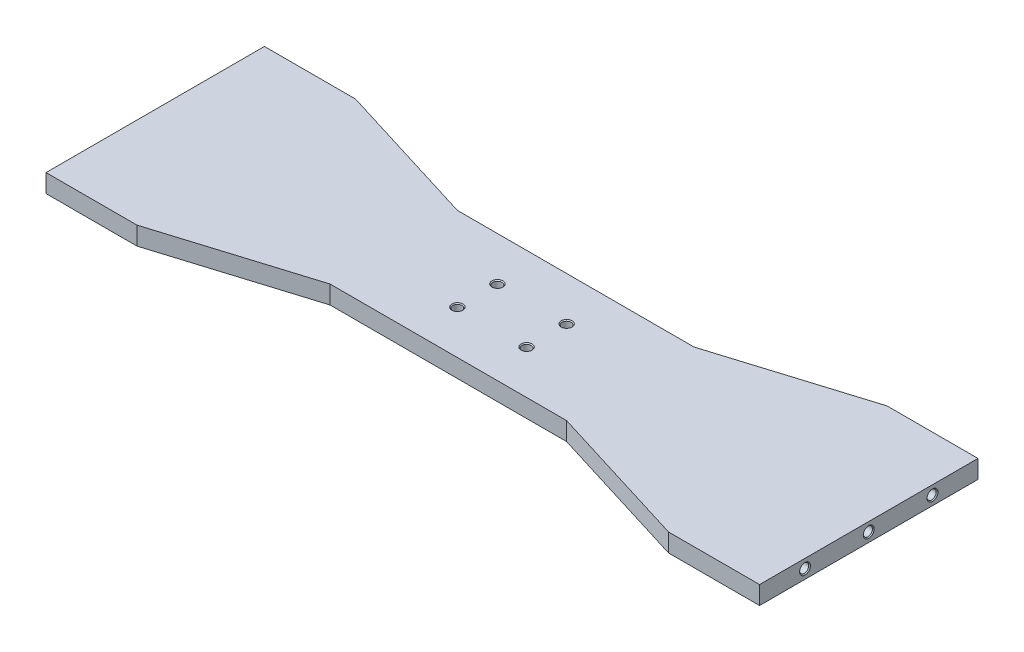
ISO-10303-21;
HEADER;
FILE_DESCRIPTION(('STEP AP214'),'2;1');
FILE_NAME('part.step','',(''),(''),'','','');
FILE_SCHEMA(('AUTOMOTIVE_DESIGN { 1 0 10303 214 1 1 1 1 }'));
ENDSEC;
DATA;
#1=APPLICATION_CONTEXT('core data for automotive mechanical design processes');
#2=APPLICATION_PROTOCOL_DEFINITION('international standard','automotive_design',2000,#1);
#3=PRODUCT_CONTEXT('',#1,'mechanical');
#4=PRODUCT('Part','Part','',(#3));
#5=PRODUCT_RELATED_PRODUCT_CATEGORY('part','',(#4));
#6=PRODUCT_DEFINITION_FORMATION('','',#4);
#7=PRODUCT_DEFINITION_CONTEXT('part definition',#1,'design');
#8=PRODUCT_DEFINITION('design','',#6,#7);
#9=PRODUCT_DEFINITION_SHAPE('','',#8);
#10=(LENGTH_UNIT() NAMED_UNIT(*) SI_UNIT(.MILLI.,.METRE.));
#11=(NAMED_UNIT(*) PLANE_ANGLE_UNIT() SI_UNIT($,.RADIAN.));
#12=(NAMED_UNIT(*) SI_UNIT($,.STERADIAN.) SOLID_ANGLE_UNIT());
#13=UNCERTAINTY_MEASURE_WITH_UNIT(LENGTH_MEASURE(1.E-05),#10,'distance_accuracy_value','');
#14=(GEOMETRIC_REPRESENTATION_CONTEXT(3) GLOBAL_UNCERTAINTY_ASSIGNED_CONTEXT((#13)) GLOBAL_UNIT_ASSIGNED_CONTEXT((#10,
#11,#12)) REPRESENTATION_CONTEXT('',''));
#15=CARTESIAN_POINT('',(0.,0.,0.));
#16=DIRECTION('',(0.,0.,1.));
#17=DIRECTION('',(1.,0.,0.));
#18=AXIS2_PLACEMENT_3D('',#15,#16,#17);
#19=CARTESIAN_POINT('',(0.,-10.,-120.));
#20=DIRECTION('',(0.,0.,-1.));
#21=DIRECTION('',(-1.,0.,0.));
#22=AXIS2_PLACEMENT_3D('',#19,#20,#21);
#23=PLANE('',#22);
#24=DIRECTION('',(0.,-1.,0.));
#25=VECTOR('',#24,1.);
#26=CARTESIAN_POINT('',(342.,0.,-120.));
#27=LINE('',#26,#25);
#28=CARTESIAN_POINT('',(342.,0.,-120.));
#29=VERTEX_POINT('',#28);
#30=CARTESIAN_POINT('',(342.,-10.,-120.));
#31=VERTEX_POINT('',#30);
#32=EDGE_CURVE('E153',#29,#31,#27,.T.);
#33=ORIENTED_EDGE('',*,*,#32,.F.);
#34=DIRECTION('',(-1.,0.,0.));
#35=VECTOR('',#34,1.);
#36=CARTESIAN_POINT('',(0.,0.,-120.));
#37=LINE('',#36,#35);
#38=CARTESIAN_POINT('',(392.,0.,-120.));
#39=VERTEX_POINT('',#38);
#40=EDGE_CURVE('E202',#39,#29,#37,.T.);
#41=ORIENTED_EDGE('',*,*,#40,.F.);
#42=DIRECTION('',(0.,1.,0.));
#43=VECTOR('',#42,1.);
#44=CARTESIAN_POINT('',(392.,-10.,-120.));
#45=LINE('',#44,#43);
#46=CARTESIAN_POINT('',(392.,-10.,-120.));
#47=VERTEX_POINT('',#46);
#48=EDGE_CURVE('E229',#47,#39,#45,.T.);
#49=ORIENTED_EDGE('',*,*,#48,.F.);
#50=DIRECTION('',(-1.,0.,0.));
#51=VECTOR('',#50,1.);
#52=CARTESIAN_POINT('',(0.,-10.,-120.));
#53=LINE('',#52,#51);
#54=EDGE_CURVE('E210',#47,#31,#53,.T.);
#55=ORIENTED_EDGE('',*,*,#54,.T.);
#56=EDGE_LOOP('',(#33,#41,#49,#55));
#57=FACE_BOUND('',#56,.T.);
#58=ADVANCED_FACE('F34',(#57),#23,.T.);
#59=CARTESIAN_POINT('',(0.,-10.,0.));
#60=DIRECTION('',(0.,0.,1.));
#61=DIRECTION('',(1.,0.,0.));
#62=AXIS2_PLACEMENT_3D('',#59,#60,#61);
#63=PLANE('',#62);
#64=DIRECTION('',(0.,-1.,0.));
#65=VECTOR('',#64,1.);
#66=CARTESIAN_POINT('',(342.,0.,0.));
#67=LINE('',#66,#65);
#68=CARTESIAN_POINT('',(342.,0.,0.));
#69=VERTEX_POINT('',#68);
#70=CARTESIAN_POINT('',(342.,-10.,0.));
#71=VERTEX_POINT('',#70);
#72=EDGE_CURVE('E171',#69,#71,#67,.T.);
#73=ORIENTED_EDGE('',*,*,#72,.T.);
#74=DIRECTION('',(1.,0.,0.));
#75=VECTOR('',#74,1.);
#76=CARTESIAN_POINT('',(0.,-10.,0.));
#77=LINE('',#76,#75);
#78=CARTESIAN_POINT('',(392.,-10.,0.));
#79=VERTEX_POINT('',#78);
#80=EDGE_CURVE('E201',#71,#79,#77,.T.);
#81=ORIENTED_EDGE('',*,*,#80,.T.);
#82=DIRECTION('',(0.,1.,0.));
#83=VECTOR('',#82,1.);
#84=CARTESIAN_POINT('',(392.,-10.,0.));
#85=LINE('',#84,#83);
#86=CARTESIAN_POINT('',(392.,0.,0.));
#87=VERTEX_POINT('',#86);
#88=EDGE_CURVE('E231',#79,#87,#85,.T.);
#89=ORIENTED_EDGE('',*,*,#88,.T.);
#90=DIRECTION('',(1.,0.,0.));
#91=VECTOR('',#90,1.);
#92=CARTESIAN_POINT('',(0.,0.,0.));
#93=LINE('',#92,#91);
#94=EDGE_CURVE('E216',#69,#87,#93,.T.);
#95=ORIENTED_EDGE('',*,*,#94,.F.);
#96=EDGE_LOOP('',(#73,#81,#89,#95));
#97=FACE_BOUND('',#96,.T.);
#98=ADVANCED_FACE('F332',(#97),#63,.T.);
#99=CARTESIAN_POINT('',(0.,-10.,0.));
#100=DIRECTION('',(-1.,0.,0.));
#101=DIRECTION('',(0.,0.,1.));
#102=AXIS2_PLACEMENT_3D('',#99,#100,#101);
#103=PLANE('',#102);
#104=CARTESIAN_POINT('',(0.,-5.00000000000001,-95.));
#105=DIRECTION('',(-1.,0.,0.));
#106=DIRECTION('',(0.,0.,1.));
#107=AXIS2_PLACEMENT_3D('',#104,#105,#106);
#108=CIRCLE('',#107,3.00000000000006);
#109=CARTESIAN_POINT('',(0.,-5.00000000000001,-91.9999999999999));
#110=VERTEX_POINT('',#109);
#111=EDGE_CURVE('E309',#110,#110,#108,.F.);
#112=ORIENTED_EDGE('',*,*,#111,.T.);
#113=EDGE_LOOP('',(#112));
#114=FACE_BOUND('',#113,.T.);
#115=CARTESIAN_POINT('',(0.,-4.99999999999999,-60.));
#116=DIRECTION('',(-1.,0.,0.));
#117=DIRECTION('',(0.,0.,1.));
#118=AXIS2_PLACEMENT_3D('',#115,#116,#117);
#119=CIRCLE('',#118,3.00000000000006);
#120=CARTESIAN_POINT('',(0.,-4.99999999999999,-56.9999999999999));
#121=VERTEX_POINT('',#120);
#122=EDGE_CURVE('E306',#121,#121,#119,.F.);
#123=ORIENTED_EDGE('',*,*,#122,.T.);
#124=EDGE_LOOP('',(#123));
#125=FACE_BOUND('',#124,.T.);
#126=CARTESIAN_POINT('',(0.,-5.,-25.));
#127=DIRECTION('',(-1.,0.,0.));
#128=DIRECTION('',(0.,0.,1.));
#129=AXIS2_PLACEMENT_3D('',#126,#127,#128);
#130=CIRCLE('',#129,3.00000000000006);
#131=CARTESIAN_POINT('',(0.,-5.,-21.9999999999999));
#132=VERTEX_POINT('',#131);
#133=EDGE_CURVE('E303',#132,#132,#130,.F.);
#134=ORIENTED_EDGE('',*,*,#133,.T.);
#135=EDGE_LOOP('',(#134));
#136=FACE_BOUND('',#135,.T.);
#137=DIRECTION('',(0.,0.,1.));
#138=VECTOR('',#137,1.);
#139=CARTESIAN_POINT('',(0.,0.,0.));
#140=LINE('',#139,#138);
#141=CARTESIAN_POINT('',(0.,0.,-120.));
#142=VERTEX_POINT('',#141);
#143=CARTESIAN_POINT('',(0.,0.,0.));
#144=VERTEX_POINT('',#143);
#145=EDGE_CURVE('E197',#142,#144,#140,.T.);
#146=ORIENTED_EDGE('',*,*,#145,.F.);
#147=DIRECTION('',(0.,1.,0.));
#148=VECTOR('',#147,1.);
#149=CARTESIAN_POINT('',(0.,-10.,-120.));
#150=LINE('',#149,#148);
#151=CARTESIAN_POINT('',(0.,-10.,-120.));
#152=VERTEX_POINT('',#151);
#153=EDGE_CURVE('E225',#152,#142,#150,.T.);
#154=ORIENTED_EDGE('',*,*,#153,.F.);
#155=DIRECTION('',(0.,0.,1.));
#156=VECTOR('',#155,1.);
#157=CARTESIAN_POINT('',(0.,-10.,0.));
#158=LINE('',#157,#156);
#159=CARTESIAN_POINT('',(0.,-10.,0.));
#160=VERTEX_POINT('',#159);
#161=EDGE_CURVE('E198',#152,#160,#158,.T.);
#162=ORIENTED_EDGE('',*,*,#161,.T.);
#163=DIRECTION('',(0.,1.,0.));
#164=VECTOR('',#163,1.);
#165=CARTESIAN_POINT('',(0.,-10.,0.));
#166=LINE('',#165,#164);
#167=EDGE_CURVE('E213',#160,#144,#166,.T.);
#168=ORIENTED_EDGE('',*,*,#167,.T.);
#169=EDGE_LOOP('',(#146,#154,#162,#168));
#170=FACE_BOUND('',#169,.T.);
#171=ADVANCED_FACE('F339',(#114,#125,#136,#170),#103,.T.);
#172=DIRECTION('',(0.,-1.,0.));
#173=VECTOR('',#172,1.);
#174=CARTESIAN_POINT('',(50.,0.,-120.));
#175=LINE('',#174,#173);
#176=CARTESIAN_POINT('',(50.,0.,-120.));
#177=VERTEX_POINT('',#176);
#178=CARTESIAN_POINT('',(50.,-10.,-120.));
#179=VERTEX_POINT('',#178);
#180=EDGE_CURVE('E49',#177,#179,#175,.T.);
#181=ORIENTED_EDGE('',*,*,#180,.T.);
#182=EDGE_CURVE('E209',#179,#152,#53,.T.);
#183=ORIENTED_EDGE('',*,*,#182,.T.);
#184=ORIENTED_EDGE('',*,*,#153,.T.);
#185=EDGE_CURVE('E223',#177,#142,#37,.T.);
#186=ORIENTED_EDGE('',*,*,#185,.F.);
#187=EDGE_LOOP('',(#181,#183,#184,#186));
#188=FACE_BOUND('',#187,.T.);
#189=ADVANCED_FACE('F335',(#188),#23,.T.);
#190=CARTESIAN_POINT('',(392.,-10.,0.));
#191=DIRECTION('',(1.,0.,0.));
#192=DIRECTION('',(0.,0.,-1.));
#193=AXIS2_PLACEMENT_3D('',#190,#191,#192);
#194=PLANE('',#193);
#195=CARTESIAN_POINT('',(392.,-5.,-95.));
#196=DIRECTION('',(1.,0.,0.));
#197=DIRECTION('',(0.,0.,-1.));
#198=AXIS2_PLACEMENT_3D('',#195,#196,#197);
#199=CIRCLE('',#198,2.99999999999995);
#200=CARTESIAN_POINT('',(392.,-5.,-97.9999999999999));
#201=VERTEX_POINT('',#200);
#202=EDGE_CURVE('E291',#201,#201,#199,.F.);
#203=ORIENTED_EDGE('',*,*,#202,.T.);
#204=EDGE_LOOP('',(#203));
#205=FACE_BOUND('',#204,.T.);
#206=CARTESIAN_POINT('',(392.,-5.,-60.));
#207=DIRECTION('',(1.,0.,0.));
#208=DIRECTION('',(0.,0.,-1.));
#209=AXIS2_PLACEMENT_3D('',#206,#207,#208);
#210=CIRCLE('',#209,2.99999999999995);
#211=CARTESIAN_POINT('',(392.,-5.,-62.9999999999999));
#212=VERTEX_POINT('',#211);
#213=EDGE_CURVE('E288',#212,#212,#210,.F.);
#214=ORIENTED_EDGE('',*,*,#213,.T.);
#215=EDGE_LOOP('',(#214));
#216=FACE_BOUND('',#215,.T.);
#217=CARTESIAN_POINT('',(392.,-5.,-25.));
#218=DIRECTION('',(1.,0.,0.));
#219=DIRECTION('',(0.,0.,-1.));
#220=AXIS2_PLACEMENT_3D('',#217,#218,#219);
#221=CIRCLE('',#220,2.99999999999995);
#222=CARTESIAN_POINT('',(392.,-5.,-27.9999999999999));
#223=VERTEX_POINT('',#222);
#224=EDGE_CURVE('E285',#223,#223,#221,.F.);
#225=ORIENTED_EDGE('',*,*,#224,.T.);
#226=EDGE_LOOP('',(#225));
#227=FACE_BOUND('',#226,.T.);
#228=DIRECTION('',(0.,0.,-1.));
#229=VECTOR('',#228,1.);
#230=CARTESIAN_POINT('',(392.,0.,0.));
#231=LINE('',#230,#229);
#232=EDGE_CURVE('E220',#87,#39,#231,.T.);
#233=ORIENTED_EDGE('',*,*,#232,.F.);
#234=ORIENTED_EDGE('',*,*,#88,.F.);
#235=DIRECTION('',(0.,0.,-1.));
#236=VECTOR('',#235,1.);
#237=CARTESIAN_POINT('',(392.,-10.,0.));
#238=LINE('',#237,#236);
#239=EDGE_CURVE('E206',#79,#47,#238,.T.);
#240=ORIENTED_EDGE('',*,*,#239,.T.);
#241=ORIENTED_EDGE('',*,*,#48,.T.);
#242=EDGE_LOOP('',(#233,#234,#240,#241));
#243=FACE_BOUND('',#242,.T.);
#244=ADVANCED_FACE('F347',(#205,#216,#227,#243),#194,.T.);
#245=DIRECTION('',(0.,-1.,0.));
#246=VECTOR('',#245,1.);
#247=CARTESIAN_POINT('',(50.,0.,0.));
#248=LINE('',#247,#246);
#249=CARTESIAN_POINT('',(50.,0.,0.));
#250=VERTEX_POINT('',#249);
#251=CARTESIAN_POINT('',(50.,-10.,0.));
#252=VERTEX_POINT('',#251);
#253=EDGE_CURVE('E164',#250,#252,#248,.T.);
#254=ORIENTED_EDGE('',*,*,#253,.F.);
#255=EDGE_CURVE('E217',#144,#250,#93,.T.);
#256=ORIENTED_EDGE('',*,*,#255,.F.);
#257=ORIENTED_EDGE('',*,*,#167,.F.);
#258=EDGE_CURVE('E203',#160,#252,#77,.T.);
#259=ORIENTED_EDGE('',*,*,#258,.T.);
#260=EDGE_LOOP('',(#254,#256,#257,#259));
#261=FACE_BOUND('',#260,.T.);
#262=ADVANCED_FACE('F342',(#261),#63,.T.);
#263=CARTESIAN_POINT('',(0.,-10.,0.));
#264=DIRECTION('',(0.,-1.,0.));
#265=DIRECTION('',(0.,0.,-1.));
#266=AXIS2_PLACEMENT_3D('',#263,#264,#265);
#267=PLANE('',#266);
#268=DIRECTION('',(-0.955523587895542,0.,0.294914687622081));
#269=VECTOR('',#268,1.);
#270=CARTESIAN_POINT('',(261.,-10.,-95.));
#271=LINE('',#270,#269);
#272=CARTESIAN_POINT('',(261.,-10.,-95.));
#273=VERTEX_POINT('',#272);
#274=EDGE_CURVE('E141',#31,#273,#271,.T.);
#275=ORIENTED_EDGE('',*,*,#274,.F.);
#276=ORIENTED_EDGE('',*,*,#54,.F.);
#277=ORIENTED_EDGE('',*,*,#239,.F.);
#278=ORIENTED_EDGE('',*,*,#80,.F.);
#279=DIRECTION('',(0.955523587895542,0.,0.294914687622081));
#280=VECTOR('',#279,1.);
#281=CARTESIAN_POINT('',(261.,-10.,-25.));
#282=LINE('',#281,#280);
#283=CARTESIAN_POINT('',(261.,-10.,-25.));
#284=VERTEX_POINT('',#283);
#285=EDGE_CURVE('E159',#284,#71,#282,.T.);
#286=ORIENTED_EDGE('',*,*,#285,.F.);
#287=DIRECTION('',(1.,0.,0.));
#288=VECTOR('',#287,1.);
#289=CARTESIAN_POINT('',(131.,-10.,-25.));
#290=LINE('',#289,#288);
#291=CARTESIAN_POINT('',(131.,-10.,-25.));
#292=VERTEX_POINT('',#291);
#293=EDGE_CURVE('E167',#292,#284,#290,.T.);
#294=ORIENTED_EDGE('',*,*,#293,.F.);
#295=DIRECTION('',(0.955523587895542,0.,-0.294914687622081));
#296=VECTOR('',#295,1.);
#297=CARTESIAN_POINT('',(50.,-10.,0.));
#298=LINE('',#297,#296);
#299=EDGE_CURVE('E152',#252,#292,#298,.T.);
#300=ORIENTED_EDGE('',*,*,#299,.F.);
#301=ORIENTED_EDGE('',*,*,#258,.F.);
#302=ORIENTED_EDGE('',*,*,#161,.F.);
#303=ORIENTED_EDGE('',*,*,#182,.F.);
#304=DIRECTION('',(-0.955523587895542,0.,-0.294914687622081));
#305=VECTOR('',#304,1.);
#306=CARTESIAN_POINT('',(50.,-10.,-120.));
#307=LINE('',#306,#305);
#308=CARTESIAN_POINT('',(131.,-10.,-95.));
#309=VERTEX_POINT('',#308);
#310=EDGE_CURVE('E144',#309,#179,#307,.T.);
#311=ORIENTED_EDGE('',*,*,#310,.F.);
#312=DIRECTION('',(-1.,0.,0.));
#313=VECTOR('',#312,1.);
#314=CARTESIAN_POINT('',(131.,-10.,-95.));
#315=LINE('',#314,#313);
#316=EDGE_CURVE('E130',#273,#309,#315,.T.);
#317=ORIENTED_EDGE('',*,*,#316,.F.);
#318=EDGE_LOOP('',(#275,#276,#277,#278,#286,#294,#300,#301,#302,#303,#311,#317));
#319=FACE_BOUND('',#318,.T.);
#320=CARTESIAN_POINT('',(215.,-10.,-49.));
#321=DIRECTION('',(0.,-1.,0.));
#322=DIRECTION('',(0.,0.,-1.));
#323=AXIS2_PLACEMENT_3D('',#320,#321,#322);
#324=CIRCLE('',#323,3.);
#325=CARTESIAN_POINT('',(215.,-10.,-52.));
#326=VERTEX_POINT('',#325);
#327=EDGE_CURVE('E279',#326,#326,#324,.F.);
#328=ORIENTED_EDGE('',*,*,#327,.T.);
#329=EDGE_LOOP('',(#328));
#330=FACE_BOUND('',#329,.T.);
#331=CARTESIAN_POINT('',(215.,-10.,-71.));
#332=DIRECTION('',(0.,-1.,0.));
#333=DIRECTION('',(0.,0.,-1.));
#334=AXIS2_PLACEMENT_3D('',#331,#332,#333);
#335=CIRCLE('',#334,3.);
#336=CARTESIAN_POINT('',(215.,-10.,-74.));
#337=VERTEX_POINT('',#336);
#338=EDGE_CURVE('E276',#337,#337,#335,.F.);
#339=ORIENTED_EDGE('',*,*,#338,.T.);
#340=EDGE_LOOP('',(#339));
#341=FACE_BOUND('',#340,.T.);
#342=CARTESIAN_POINT('',(177.,-10.,-71.));
#343=DIRECTION('',(0.,-1.,0.));
#344=DIRECTION('',(0.,0.,-1.));
#345=AXIS2_PLACEMENT_3D('',#342,#343,#344);
#346=CIRCLE('',#345,3.);
#347=CARTESIAN_POINT('',(177.,-10.,-74.));
#348=VERTEX_POINT('',#347);
#349=EDGE_CURVE('E273',#348,#348,#346,.F.);
#350=ORIENTED_EDGE('',*,*,#349,.T.);
#351=EDGE_LOOP('',(#350));
#352=FACE_BOUND('',#351,.T.);
#353=CARTESIAN_POINT('',(177.,-10.,-49.));
#354=DIRECTION('',(0.,-1.,0.));
#355=DIRECTION('',(0.,0.,-1.));
#356=AXIS2_PLACEMENT_3D('',#353,#354,#355);
#357=CIRCLE('',#356,3.);
#358=CARTESIAN_POINT('',(177.,-10.,-52.));
#359=VERTEX_POINT('',#358);
#360=EDGE_CURVE('E270',#359,#359,#357,.F.);
#361=ORIENTED_EDGE('',*,*,#360,.T.);
#362=EDGE_LOOP('',(#361));
#363=FACE_BOUND('',#362,.T.);
#364=ADVANCED_FACE('F361',(#319,#330,#341,#352,#363),#267,.T.);
#365=CARTESIAN_POINT('',(0.,0.,0.));
#366=DIRECTION('',(0.,-1.,0.));
#367=DIRECTION('',(0.,0.,-1.));
#368=AXIS2_PLACEMENT_3D('',#365,#366,#367);
#369=PLANE('',#368);
#370=CARTESIAN_POINT('',(177.,0.,-49.));
#371=DIRECTION('',(0.,-1.,0.));
#372=DIRECTION('',(0.,0.,-1.));
#373=AXIS2_PLACEMENT_3D('',#370,#371,#372);
#374=CIRCLE('',#373,2.99999999999995);
#375=CARTESIAN_POINT('',(177.,0.,-52.));
#376=VERTEX_POINT('',#375);
#377=EDGE_CURVE('E243',#376,#376,#374,.T.);
#378=ORIENTED_EDGE('',*,*,#377,.T.);
#379=EDGE_LOOP('',(#378));
#380=FACE_BOUND('',#379,.T.);
#381=CARTESIAN_POINT('',(177.,0.,-71.));
#382=DIRECTION('',(0.,-1.,0.));
#383=DIRECTION('',(0.,0.,-1.));
#384=AXIS2_PLACEMENT_3D('',#381,#382,#383);
#385=CIRCLE('',#384,2.99999999999995);
#386=CARTESIAN_POINT('',(177.,0.,-73.9999999999999));
#387=VERTEX_POINT('',#386);
#388=EDGE_CURVE('E240',#387,#387,#385,.T.);
#389=ORIENTED_EDGE('',*,*,#388,.T.);
#390=EDGE_LOOP('',(#389));
#391=FACE_BOUND('',#390,.T.);
#392=CARTESIAN_POINT('',(215.,0.,-71.));
#393=DIRECTION('',(0.,-1.,0.));
#394=DIRECTION('',(0.,0.,-1.));
#395=AXIS2_PLACEMENT_3D('',#392,#393,#394);
#396=CIRCLE('',#395,2.99999999999995);
#397=CARTESIAN_POINT('',(215.,0.,-73.9999999999999));
#398=VERTEX_POINT('',#397);
#399=EDGE_CURVE('E237',#398,#398,#396,.T.);
#400=ORIENTED_EDGE('',*,*,#399,.T.);
#401=EDGE_LOOP('',(#400));
#402=FACE_BOUND('',#401,.T.);
#403=CARTESIAN_POINT('',(215.,0.,-49.));
#404=DIRECTION('',(0.,-1.,0.));
#405=DIRECTION('',(0.,0.,-1.));
#406=AXIS2_PLACEMENT_3D('',#403,#404,#405);
#407=CIRCLE('',#406,2.99999999999995);
#408=CARTESIAN_POINT('',(215.,0.,-52.));
#409=VERTEX_POINT('',#408);
#410=EDGE_CURVE('E228',#409,#409,#407,.T.);
#411=ORIENTED_EDGE('',*,*,#410,.T.);
#412=EDGE_LOOP('',(#411));
#413=FACE_BOUND('',#412,.T.);
#414=ORIENTED_EDGE('',*,*,#40,.T.);
#415=DIRECTION('',(-0.955523587895542,0.,0.294914687622081));
#416=VECTOR('',#415,1.);
#417=CARTESIAN_POINT('',(261.,0.,-95.));
#418=LINE('',#417,#416);
#419=CARTESIAN_POINT('',(261.,0.,-95.));
#420=VERTEX_POINT('',#419);
#421=EDGE_CURVE('E132',#29,#420,#418,.T.);
#422=ORIENTED_EDGE('',*,*,#421,.T.);
#423=DIRECTION('',(-1.,0.,0.));
#424=VECTOR('',#423,1.);
#425=CARTESIAN_POINT('',(131.,0.,-95.));
#426=LINE('',#425,#424);
#427=CARTESIAN_POINT('',(131.,0.,-95.));
#428=VERTEX_POINT('',#427);
#429=EDGE_CURVE('E127',#420,#428,#426,.T.);
#430=ORIENTED_EDGE('',*,*,#429,.T.);
#431=DIRECTION('',(-0.955523587895542,0.,-0.294914687622081));
#432=VECTOR('',#431,1.);
#433=CARTESIAN_POINT('',(50.,0.,-120.));
#434=LINE('',#433,#432);
#435=EDGE_CURVE('E134',#428,#177,#434,.T.);
#436=ORIENTED_EDGE('',*,*,#435,.T.);
#437=ORIENTED_EDGE('',*,*,#185,.T.);
#438=ORIENTED_EDGE('',*,*,#145,.T.);
#439=ORIENTED_EDGE('',*,*,#255,.T.);
#440=DIRECTION('',(0.955523587895542,0.,-0.294914687622081));
#441=VECTOR('',#440,1.);
#442=CARTESIAN_POINT('',(50.,0.,0.));
#443=LINE('',#442,#441);
#444=CARTESIAN_POINT('',(131.,0.,-25.));
#445=VERTEX_POINT('',#444);
#446=EDGE_CURVE('E156',#250,#445,#443,.T.);
#447=ORIENTED_EDGE('',*,*,#446,.T.);
#448=DIRECTION('',(1.,0.,0.));
#449=VECTOR('',#448,1.);
#450=CARTESIAN_POINT('',(131.,0.,-25.));
#451=LINE('',#450,#449);
#452=CARTESIAN_POINT('',(261.,0.,-25.));
#453=VERTEX_POINT('',#452);
#454=EDGE_CURVE('E57',#445,#453,#451,.T.);
#455=ORIENTED_EDGE('',*,*,#454,.T.);
#456=DIRECTION('',(0.955523587895542,0.,0.294914687622081));
#457=VECTOR('',#456,1.);
#458=CARTESIAN_POINT('',(261.,0.,-25.));
#459=LINE('',#458,#457);
#460=EDGE_CURVE('E161',#453,#69,#459,.T.);
#461=ORIENTED_EDGE('',*,*,#460,.T.);
#462=ORIENTED_EDGE('',*,*,#94,.T.);
#463=ORIENTED_EDGE('',*,*,#232,.T.);
#464=EDGE_LOOP('',(#414,#422,#430,#436,#437,#438,#439,#447,#455,#461,#462,#463));
#465=FACE_BOUND('',#464,.T.);
#466=ADVANCED_FACE('F140',(#380,#391,#402,#413,#465),#369,.F.);
#467=CARTESIAN_POINT('',(177.,0.,-49.));
#468=DIRECTION('',(0.,-1.,0.));
#469=DIRECTION('',(0.,0.,-1.));
#470=AXIS2_PLACEMENT_3D('',#467,#468,#469);
#471=CYLINDRICAL_SURFACE('',#470,2.5);
#472=CARTESIAN_POINT('',(177.,-0.49999999999996,-49.));
#473=DIRECTION('',(0.,-1.,0.));
#474=DIRECTION('',(0.,0.,-1.));
#475=AXIS2_PLACEMENT_3D('',#472,#473,#474);
#476=CIRCLE('',#475,2.5);
#477=CARTESIAN_POINT('',(177.,-0.49999999999996,-51.5));
#478=VERTEX_POINT('',#477);
#479=EDGE_CURVE('E249',#478,#478,#476,.F.);
#480=ORIENTED_EDGE('',*,*,#479,.T.);
#481=EDGE_LOOP('',(#480));
#482=FACE_BOUND('',#481,.T.);
#483=CARTESIAN_POINT('',(177.,-9.49999999999998,-49.));
#484=DIRECTION('',(0.,-1.,0.));
#485=DIRECTION('',(0.,0.,-1.));
#486=AXIS2_PLACEMENT_3D('',#483,#484,#485);
#487=CIRCLE('',#486,2.5);
#488=CARTESIAN_POINT('',(177.,-9.49999999999998,-51.5));
#489=VERTEX_POINT('',#488);
#490=EDGE_CURVE('E246',#489,#489,#487,.T.);
#491=ORIENTED_EDGE('',*,*,#490,.T.);
#492=EDGE_LOOP('',(#491));
#493=FACE_BOUND('',#492,.T.);
#494=ADVANCED_FACE('F462',(#482,#493),#471,.F.);
#495=CARTESIAN_POINT('',(177.,0.,-71.));
#496=DIRECTION('',(0.,-1.,0.));
#497=DIRECTION('',(0.,0.,-1.));
#498=AXIS2_PLACEMENT_3D('',#495,#496,#497);
#499=CYLINDRICAL_SURFACE('',#498,2.5);
#500=CARTESIAN_POINT('',(177.,-0.49999999999996,-71.));
#501=DIRECTION('',(0.,-1.,0.));
#502=DIRECTION('',(0.,0.,-1.));
#503=AXIS2_PLACEMENT_3D('',#500,#501,#502);
#504=CIRCLE('',#503,2.5);
#505=CARTESIAN_POINT('',(177.,-0.49999999999996,-73.5));
#506=VERTEX_POINT('',#505);
#507=EDGE_CURVE('E255',#506,#506,#504,.F.);
#508=ORIENTED_EDGE('',*,*,#507,.T.);
#509=EDGE_LOOP('',(#508));
#510=FACE_BOUND('',#509,.T.);
#511=CARTESIAN_POINT('',(177.,-9.49999999999998,-71.));
#512=DIRECTION('',(0.,-1.,0.));
#513=DIRECTION('',(0.,0.,-1.));
#514=AXIS2_PLACEMENT_3D('',#511,#512,#513);
#515=CIRCLE('',#514,2.5);
#516=CARTESIAN_POINT('',(177.,-9.49999999999998,-73.5));
#517=VERTEX_POINT('',#516);
#518=EDGE_CURVE('E252',#517,#517,#515,.T.);
#519=ORIENTED_EDGE('',*,*,#518,.T.);
#520=EDGE_LOOP('',(#519));
#521=FACE_BOUND('',#520,.T.);
#522=ADVANCED_FACE('F458',(#510,#521),#499,.F.);
#523=CARTESIAN_POINT('',(215.,0.,-49.));
#524=DIRECTION('',(0.,-1.,0.));
#525=DIRECTION('',(0.,0.,-1.));
#526=AXIS2_PLACEMENT_3D('',#523,#524,#525);
#527=CYLINDRICAL_SURFACE('',#526,2.5);
#528=CARTESIAN_POINT('',(215.,-0.49999999999996,-49.));
#529=DIRECTION('',(0.,-1.,0.));
#530=DIRECTION('',(0.,0.,-1.));
#531=AXIS2_PLACEMENT_3D('',#528,#529,#530);
#532=CIRCLE('',#531,2.5);
#533=CARTESIAN_POINT('',(215.,-0.49999999999996,-51.5));
#534=VERTEX_POINT('',#533);
#535=EDGE_CURVE('E267',#534,#534,#532,.F.);
#536=ORIENTED_EDGE('',*,*,#535,.T.);
#537=EDGE_LOOP('',(#536));
#538=FACE_BOUND('',#537,.T.);
#539=CARTESIAN_POINT('',(215.,-9.49999999999998,-49.));
#540=DIRECTION('',(0.,-1.,0.));
#541=DIRECTION('',(0.,0.,-1.));
#542=AXIS2_PLACEMENT_3D('',#539,#540,#541);
#543=CIRCLE('',#542,2.5);
#544=CARTESIAN_POINT('',(215.,-9.49999999999998,-51.5));
#545=VERTEX_POINT('',#544);
#546=EDGE_CURVE('E264',#545,#545,#543,.T.);
#547=ORIENTED_EDGE('',*,*,#546,.T.);
#548=EDGE_LOOP('',(#547));
#549=FACE_BOUND('',#548,.T.);
#550=ADVANCED_FACE('F454',(#538,#549),#527,.F.);
#551=CARTESIAN_POINT('',(215.,0.,-71.));
#552=DIRECTION('',(0.,-1.,0.));
#553=DIRECTION('',(0.,0.,-1.));
#554=AXIS2_PLACEMENT_3D('',#551,#552,#553);
#555=CYLINDRICAL_SURFACE('',#554,2.5);
#556=CARTESIAN_POINT('',(215.,-0.49999999999996,-71.));
#557=DIRECTION('',(0.,-1.,0.));
#558=DIRECTION('',(0.,0.,-1.));
#559=AXIS2_PLACEMENT_3D('',#556,#557,#558);
#560=CIRCLE('',#559,2.5);
#561=CARTESIAN_POINT('',(215.,-0.49999999999996,-73.5));
#562=VERTEX_POINT('',#561);
#563=EDGE_CURVE('E261',#562,#562,#560,.F.);
#564=ORIENTED_EDGE('',*,*,#563,.T.);
#565=EDGE_LOOP('',(#564));
#566=FACE_BOUND('',#565,.T.);
#567=CARTESIAN_POINT('',(215.,-9.49999999999998,-71.));
#568=DIRECTION('',(0.,-1.,0.));
#569=DIRECTION('',(0.,0.,-1.));
#570=AXIS2_PLACEMENT_3D('',#567,#568,#569);
#571=CIRCLE('',#570,2.5);
#572=CARTESIAN_POINT('',(215.,-9.49999999999998,-73.5));
#573=VERTEX_POINT('',#572);
#574=EDGE_CURVE('E258',#573,#573,#571,.T.);
#575=ORIENTED_EDGE('',*,*,#574,.T.);
#576=EDGE_LOOP('',(#575));
#577=FACE_BOUND('',#576,.T.);
#578=ADVANCED_FACE('F450',(#566,#577),#555,.F.);
#579=CARTESIAN_POINT('',(177.,0.,-49.));
#580=DIRECTION('',(0.,1.,0.));
#581=DIRECTION('',(0.,0.,1.));
#582=AXIS2_PLACEMENT_3D('',#579,#580,#581);
#583=CONICAL_SURFACE('',#582,2.99999999999995,0.78539816339744);
#584=ORIENTED_EDGE('',*,*,#479,.F.);
#585=EDGE_LOOP('',(#584));
#586=FACE_BOUND('',#585,.T.);
#587=ORIENTED_EDGE('',*,*,#377,.F.);
#588=EDGE_LOOP('',(#587));
#589=FACE_BOUND('',#588,.T.);
#590=ADVANCED_FACE('F453',(#586,#589),#583,.F.);
#591=CARTESIAN_POINT('',(177.,0.,-71.));
#592=DIRECTION('',(0.,1.,0.));
#593=DIRECTION('',(0.,0.,1.));
#594=AXIS2_PLACEMENT_3D('',#591,#592,#593);
#595=CONICAL_SURFACE('',#594,2.99999999999995,0.78539816339744);
#596=ORIENTED_EDGE('',*,*,#507,.F.);
#597=EDGE_LOOP('',(#596));
#598=FACE_BOUND('',#597,.T.);
#599=ORIENTED_EDGE('',*,*,#388,.F.);
#600=EDGE_LOOP('',(#599));
#601=FACE_BOUND('',#600,.T.);
#602=ADVANCED_FACE('F493',(#598,#601),#595,.F.);
#603=CARTESIAN_POINT('',(215.,0.,-71.));
#604=DIRECTION('',(0.,1.,0.));
#605=DIRECTION('',(0.,0.,1.));
#606=AXIS2_PLACEMENT_3D('',#603,#604,#605);
#607=CONICAL_SURFACE('',#606,2.99999999999995,0.78539816339744);
#608=ORIENTED_EDGE('',*,*,#563,.F.);
#609=EDGE_LOOP('',(#608));
#610=FACE_BOUND('',#609,.T.);
#611=ORIENTED_EDGE('',*,*,#399,.F.);
#612=EDGE_LOOP('',(#611));
#613=FACE_BOUND('',#612,.T.);
#614=ADVANCED_FACE('F483',(#610,#613),#607,.F.);
#615=CARTESIAN_POINT('',(215.,0.,-49.));
#616=DIRECTION('',(0.,1.,0.));
#617=DIRECTION('',(0.,0.,1.));
#618=AXIS2_PLACEMENT_3D('',#615,#616,#617);
#619=CONICAL_SURFACE('',#618,2.99999999999995,0.78539816339744);
#620=ORIENTED_EDGE('',*,*,#535,.F.);
#621=EDGE_LOOP('',(#620));
#622=FACE_BOUND('',#621,.T.);
#623=ORIENTED_EDGE('',*,*,#410,.F.);
#624=EDGE_LOOP('',(#623));
#625=FACE_BOUND('',#624,.T.);
#626=ADVANCED_FACE('F480',(#622,#625),#619,.F.);
#627=CARTESIAN_POINT('',(215.,-9.49999999999998,-49.));
#628=DIRECTION('',(0.,-1.,0.));
#629=DIRECTION('',(0.,0.,-1.));
#630=AXIS2_PLACEMENT_3D('',#627,#628,#629);
#631=CONICAL_SURFACE('',#630,2.5,0.785398163397439);
#632=ORIENTED_EDGE('',*,*,#327,.F.);
#633=EDGE_LOOP('',(#632));
#634=FACE_BOUND('',#633,.T.);
#635=ORIENTED_EDGE('',*,*,#546,.F.);
#636=EDGE_LOOP('',(#635));
#637=FACE_BOUND('',#636,.T.);
#638=ADVANCED_FACE('F482',(#634,#637),#631,.F.);
#639=CARTESIAN_POINT('',(215.,-9.49999999999998,-71.));
#640=DIRECTION('',(0.,-1.,0.));
#641=DIRECTION('',(0.,0.,-1.));
#642=AXIS2_PLACEMENT_3D('',#639,#640,#641);
#643=CONICAL_SURFACE('',#642,2.5,0.785398163397439);
#644=ORIENTED_EDGE('',*,*,#338,.F.);
#645=EDGE_LOOP('',(#644));
#646=FACE_BOUND('',#645,.T.);
#647=ORIENTED_EDGE('',*,*,#574,.F.);
#648=EDGE_LOOP('',(#647));
#649=FACE_BOUND('',#648,.T.);
#650=ADVANCED_FACE('F490',(#646,#649),#643,.F.);
#651=CARTESIAN_POINT('',(177.,-9.49999999999998,-71.));
#652=DIRECTION('',(0.,-1.,0.));
#653=DIRECTION('',(0.,0.,-1.));
#654=AXIS2_PLACEMENT_3D('',#651,#652,#653);
#655=CONICAL_SURFACE('',#654,2.5,0.785398163397439);
#656=ORIENTED_EDGE('',*,*,#349,.F.);
#657=EDGE_LOOP('',(#656));
#658=FACE_BOUND('',#657,.T.);
#659=ORIENTED_EDGE('',*,*,#518,.F.);
#660=EDGE_LOOP('',(#659));
#661=FACE_BOUND('',#660,.T.);
#662=ADVANCED_FACE('F501',(#658,#661),#655,.F.);
#663=CARTESIAN_POINT('',(177.,-9.49999999999998,-49.));
#664=DIRECTION('',(0.,-1.,0.));
#665=DIRECTION('',(0.,0.,-1.));
#666=AXIS2_PLACEMENT_3D('',#663,#664,#665);
#667=CONICAL_SURFACE('',#666,2.5,0.785398163397439);
#668=ORIENTED_EDGE('',*,*,#360,.F.);
#669=EDGE_LOOP('',(#668));
#670=FACE_BOUND('',#669,.T.);
#671=ORIENTED_EDGE('',*,*,#490,.F.);
#672=EDGE_LOOP('',(#671));
#673=FACE_BOUND('',#672,.T.);
#674=ADVANCED_FACE('F448',(#670,#673),#667,.F.);
#675=CARTESIAN_POINT('',(362.,-5.,-25.));
#676=DIRECTION('',(1.,0.,0.));
#677=DIRECTION('',(0.,0.,-1.));
#678=AXIS2_PLACEMENT_3D('',#675,#676,#677);
#679=CYLINDRICAL_SURFACE('',#678,2.5);
#680=CARTESIAN_POINT('',(391.5,-5.,-25.));
#681=DIRECTION('',(1.,0.,0.));
#682=DIRECTION('',(0.,0.,-1.));
#683=AXIS2_PLACEMENT_3D('',#680,#681,#682);
#684=CIRCLE('',#683,2.5);
#685=CARTESIAN_POINT('',(391.5,-5.,-27.5));
#686=VERTEX_POINT('',#685);
#687=EDGE_CURVE('E297',#686,#686,#684,.T.);
#688=ORIENTED_EDGE('',*,*,#687,.T.);
#689=EDGE_LOOP('',(#688));
#690=FACE_BOUND('',#689,.T.);
#691=CARTESIAN_POINT('',(362.,-5.,-25.));
#692=DIRECTION('',(1.,0.,0.));
#693=DIRECTION('',(0.,0.,-1.));
#694=AXIS2_PLACEMENT_3D('',#691,#692,#693);
#695=CIRCLE('',#694,2.5);
#696=CARTESIAN_POINT('',(362.,-5.,-27.5));
#697=VERTEX_POINT('',#696);
#698=EDGE_CURVE('E194',#697,#697,#695,.T.);
#699=ORIENTED_EDGE('',*,*,#698,.F.);
#700=EDGE_LOOP('',(#699));
#701=FACE_BOUND('',#700,.T.);
#702=ADVANCED_FACE('F444',(#690,#701),#679,.F.);
#703=CARTESIAN_POINT('',(362.,-5.,-25.));
#704=DIRECTION('',(1.,0.,0.));
#705=DIRECTION('',(0.,0.,-1.));
#706=AXIS2_PLACEMENT_3D('',#703,#704,#705);
#707=PLANE('',#706);
#708=ORIENTED_EDGE('',*,*,#698,.T.);
#709=EDGE_LOOP('',(#708));
#710=FACE_BOUND('',#709,.T.);
#711=ADVANCED_FACE('F440',(#710),#707,.T.);
#712=CARTESIAN_POINT('',(362.,-5.,-60.));
#713=DIRECTION('',(1.,0.,0.));
#714=DIRECTION('',(0.,0.,-1.));
#715=AXIS2_PLACEMENT_3D('',#712,#713,#714);
#716=CYLINDRICAL_SURFACE('',#715,2.49999999999999);
#717=CARTESIAN_POINT('',(391.5,-5.,-60.));
#718=DIRECTION('',(1.,0.,0.));
#719=DIRECTION('',(0.,0.,-1.));
#720=AXIS2_PLACEMENT_3D('',#717,#718,#719);
#721=CIRCLE('',#720,2.49999999999999);
#722=CARTESIAN_POINT('',(391.5,-5.,-62.5));
#723=VERTEX_POINT('',#722);
#724=EDGE_CURVE('E294',#723,#723,#721,.T.);
#725=ORIENTED_EDGE('',*,*,#724,.T.);
#726=EDGE_LOOP('',(#725));
#727=FACE_BOUND('',#726,.T.);
#728=CARTESIAN_POINT('',(362.,-5.,-60.));
#729=DIRECTION('',(1.,0.,0.));
#730=DIRECTION('',(0.,0.,-1.));
#731=AXIS2_PLACEMENT_3D('',#728,#729,#730);
#732=CIRCLE('',#731,2.49999999999999);
#733=CARTESIAN_POINT('',(362.,-5.,-62.5));
#734=VERTEX_POINT('',#733);
#735=EDGE_CURVE('E191',#734,#734,#732,.T.);
#736=ORIENTED_EDGE('',*,*,#735,.F.);
#737=EDGE_LOOP('',(#736));
#738=FACE_BOUND('',#737,.T.);
#739=ADVANCED_FACE('F436',(#727,#738),#716,.F.);
#740=CARTESIAN_POINT('',(362.,-5.,-60.));
#741=DIRECTION('',(1.,0.,0.));
#742=DIRECTION('',(0.,0.,-1.));
#743=AXIS2_PLACEMENT_3D('',#740,#741,#742);
#744=PLANE('',#743);
#745=ORIENTED_EDGE('',*,*,#735,.T.);
#746=EDGE_LOOP('',(#745));
#747=FACE_BOUND('',#746,.T.);
#748=ADVANCED_FACE('F432',(#747),#744,.T.);
#749=CARTESIAN_POINT('',(362.,-5.,-95.));
#750=DIRECTION('',(1.,0.,0.));
#751=DIRECTION('',(0.,0.,-1.));
#752=AXIS2_PLACEMENT_3D('',#749,#750,#751);
#753=CYLINDRICAL_SURFACE('',#752,2.5);
#754=CARTESIAN_POINT('',(391.5,-5.,-95.));
#755=DIRECTION('',(1.,0.,0.));
#756=DIRECTION('',(0.,0.,-1.));
#757=AXIS2_PLACEMENT_3D('',#754,#755,#756);
#758=CIRCLE('',#757,2.5);
#759=CARTESIAN_POINT('',(391.5,-5.,-97.5));
#760=VERTEX_POINT('',#759);
#761=EDGE_CURVE('E282',#760,#760,#758,.T.);
#762=ORIENTED_EDGE('',*,*,#761,.T.);
#763=EDGE_LOOP('',(#762));
#764=FACE_BOUND('',#763,.T.);
#765=CARTESIAN_POINT('',(362.,-5.,-95.));
#766=DIRECTION('',(1.,0.,0.));
#767=DIRECTION('',(0.,0.,-1.));
#768=AXIS2_PLACEMENT_3D('',#765,#766,#767);
#769=CIRCLE('',#768,2.5);
#770=CARTESIAN_POINT('',(362.,-5.,-97.5));
#771=VERTEX_POINT('',#770);
#772=EDGE_CURVE('E188',#771,#771,#769,.T.);
#773=ORIENTED_EDGE('',*,*,#772,.F.);
#774=EDGE_LOOP('',(#773));
#775=FACE_BOUND('',#774,.T.);
#776=ADVANCED_FACE('F428',(#764,#775),#753,.F.);
#777=CARTESIAN_POINT('',(362.,-5.,-95.));
#778=DIRECTION('',(1.,0.,0.));
#779=DIRECTION('',(0.,0.,-1.));
#780=AXIS2_PLACEMENT_3D('',#777,#778,#779);
#781=PLANE('',#780);
#782=ORIENTED_EDGE('',*,*,#772,.T.);
#783=EDGE_LOOP('',(#782));
#784=FACE_BOUND('',#783,.T.);
#785=ADVANCED_FACE('F424',(#784),#781,.T.);
#786=CARTESIAN_POINT('',(30.,-5.,-25.));
#787=DIRECTION('',(-1.,0.,0.));
#788=DIRECTION('',(0.,0.,1.));
#789=AXIS2_PLACEMENT_3D('',#786,#787,#788);
#790=CYLINDRICAL_SURFACE('',#789,2.5);
#791=CARTESIAN_POINT('',(0.500000000000063,-5.,-25.));
#792=DIRECTION('',(-1.,0.,0.));
#793=DIRECTION('',(0.,0.,1.));
#794=AXIS2_PLACEMENT_3D('',#791,#792,#793);
#795=CIRCLE('',#794,2.5);
#796=CARTESIAN_POINT('',(0.500000000000063,-5.,-22.5));
#797=VERTEX_POINT('',#796);
#798=EDGE_CURVE('E11',#797,#797,#795,.T.);
#799=ORIENTED_EDGE('',*,*,#798,.T.);
#800=EDGE_LOOP('',(#799));
#801=FACE_BOUND('',#800,.T.);
#802=CARTESIAN_POINT('',(30.,-5.,-25.));
#803=DIRECTION('',(-1.,0.,0.));
#804=DIRECTION('',(0.,0.,1.));
#805=AXIS2_PLACEMENT_3D('',#802,#803,#804);
#806=CIRCLE('',#805,2.5);
#807=CARTESIAN_POINT('',(30.,-5.,-22.5));
#808=VERTEX_POINT('',#807);
#809=EDGE_CURVE('E185',#808,#808,#806,.T.);
#810=ORIENTED_EDGE('',*,*,#809,.F.);
#811=EDGE_LOOP('',(#810));
#812=FACE_BOUND('',#811,.T.);
#813=ADVANCED_FACE('F420',(#801,#812),#790,.F.);
#814=CARTESIAN_POINT('',(30.,-5.,-25.));
#815=DIRECTION('',(-1.,0.,0.));
#816=DIRECTION('',(0.,0.,1.));
#817=AXIS2_PLACEMENT_3D('',#814,#815,#816);
#818=PLANE('',#817);
#819=ORIENTED_EDGE('',*,*,#809,.T.);
#820=EDGE_LOOP('',(#819));
#821=FACE_BOUND('',#820,.T.);
#822=ADVANCED_FACE('F417',(#821),#818,.T.);
#823=CARTESIAN_POINT('',(30.,-4.99999999999999,-60.));
#824=DIRECTION('',(-1.,0.,0.));
#825=DIRECTION('',(0.,0.,1.));
#826=AXIS2_PLACEMENT_3D('',#823,#824,#825);
#827=CYLINDRICAL_SURFACE('',#826,2.49999999999999);
#828=CARTESIAN_POINT('',(0.500000000000073,-4.99999999999999,-60.));
#829=DIRECTION('',(-1.,0.,0.));
#830=DIRECTION('',(0.,0.,1.));
#831=AXIS2_PLACEMENT_3D('',#828,#829,#830);
#832=CIRCLE('',#831,2.49999999999999);
#833=CARTESIAN_POINT('',(0.500000000000073,-4.99999999999999,-57.5));
#834=VERTEX_POINT('',#833);
#835=EDGE_CURVE('E42',#834,#834,#832,.T.);
#836=ORIENTED_EDGE('',*,*,#835,.T.);
#837=EDGE_LOOP('',(#836));
#838=FACE_BOUND('',#837,.T.);
#839=CARTESIAN_POINT('',(30.,-4.99999999999999,-60.));
#840=DIRECTION('',(-1.,0.,0.));
#841=DIRECTION('',(0.,0.,1.));
#842=AXIS2_PLACEMENT_3D('',#839,#840,#841);
#843=CIRCLE('',#842,2.49999999999999);
#844=CARTESIAN_POINT('',(30.,-4.99999999999999,-57.5));
#845=VERTEX_POINT('',#844);
#846=EDGE_CURVE('E182',#845,#845,#843,.T.);
#847=ORIENTED_EDGE('',*,*,#846,.F.);
#848=EDGE_LOOP('',(#847));
#849=FACE_BOUND('',#848,.T.);
#850=ADVANCED_FACE('F314',(#838,#849),#827,.F.);
#851=CARTESIAN_POINT('',(30.,-4.99999999999999,-60.));
#852=DIRECTION('',(-1.,0.,0.));
#853=DIRECTION('',(0.,0.,1.));
#854=AXIS2_PLACEMENT_3D('',#851,#852,#853);
#855=PLANE('',#854);
#856=ORIENTED_EDGE('',*,*,#846,.T.);
#857=EDGE_LOOP('',(#856));
#858=FACE_BOUND('',#857,.T.);
#859=ADVANCED_FACE('F410',(#858),#855,.T.);
#860=CARTESIAN_POINT('',(30.,-5.00000000000001,-95.));
#861=DIRECTION('',(-1.,0.,0.));
#862=DIRECTION('',(0.,0.,1.));
#863=AXIS2_PLACEMENT_3D('',#860,#861,#862);
#864=CYLINDRICAL_SURFACE('',#863,2.5);
#865=CARTESIAN_POINT('',(0.50000000000007,-5.00000000000001,-95.));
#866=DIRECTION('',(-1.,0.,0.));
#867=DIRECTION('',(0.,0.,1.));
#868=AXIS2_PLACEMENT_3D('',#865,#866,#867);
#869=CIRCLE('',#868,2.5);
#870=CARTESIAN_POINT('',(0.50000000000007,-5.00000000000001,-92.5));
#871=VERTEX_POINT('',#870);
#872=EDGE_CURVE('E300',#871,#871,#869,.T.);
#873=ORIENTED_EDGE('',*,*,#872,.T.);
#874=EDGE_LOOP('',(#873));
#875=FACE_BOUND('',#874,.T.);
#876=CARTESIAN_POINT('',(30.,-5.00000000000001,-95.));
#877=DIRECTION('',(-1.,0.,0.));
#878=DIRECTION('',(0.,0.,1.));
#879=AXIS2_PLACEMENT_3D('',#876,#877,#878);
#880=CIRCLE('',#879,2.5);
#881=CARTESIAN_POINT('',(30.,-5.00000000000001,-92.5));
#882=VERTEX_POINT('',#881);
#883=EDGE_CURVE('E174',#882,#882,#880,.T.);
#884=ORIENTED_EDGE('',*,*,#883,.F.);
#885=EDGE_LOOP('',(#884));
#886=FACE_BOUND('',#885,.T.);
#887=ADVANCED_FACE('F406',(#875,#886),#864,.F.);
#888=CARTESIAN_POINT('',(30.,-5.00000000000001,-95.));
#889=DIRECTION('',(-1.,0.,0.));
#890=DIRECTION('',(0.,0.,1.));
#891=AXIS2_PLACEMENT_3D('',#888,#889,#890);
#892=PLANE('',#891);
#893=ORIENTED_EDGE('',*,*,#883,.T.);
#894=EDGE_LOOP('',(#893));
#895=FACE_BOUND('',#894,.T.);
#896=ADVANCED_FACE('F402',(#895),#892,.T.);
#897=CARTESIAN_POINT('',(391.5,-5.,-95.));
#898=DIRECTION('',(1.,0.,0.));
#899=DIRECTION('',(0.,0.,-1.));
#900=AXIS2_PLACEMENT_3D('',#897,#898,#899);
#901=CONICAL_SURFACE('',#900,2.5,0.785398163397455);
#902=ORIENTED_EDGE('',*,*,#202,.F.);
#903=EDGE_LOOP('',(#902));
#904=FACE_BOUND('',#903,.T.);
#905=ORIENTED_EDGE('',*,*,#761,.F.);
#906=EDGE_LOOP('',(#905));
#907=FACE_BOUND('',#906,.T.);
#908=ADVANCED_FACE('F405',(#904,#907),#901,.F.);
#909=CARTESIAN_POINT('',(391.5,-5.,-60.));
#910=DIRECTION('',(1.,0.,0.));
#911=DIRECTION('',(0.,0.,-1.));
#912=AXIS2_PLACEMENT_3D('',#909,#910,#911);
#913=CONICAL_SURFACE('',#912,2.49999999999999,0.785398163397456);
#914=ORIENTED_EDGE('',*,*,#213,.F.);
#915=EDGE_LOOP('',(#914));
#916=FACE_BOUND('',#915,.T.);
#917=ORIENTED_EDGE('',*,*,#724,.F.);
#918=EDGE_LOOP('',(#917));
#919=FACE_BOUND('',#918,.T.);
#920=ADVANCED_FACE('F511',(#916,#919),#913,.F.);
#921=CARTESIAN_POINT('',(391.5,-5.,-25.));
#922=DIRECTION('',(1.,0.,0.));
#923=DIRECTION('',(0.,0.,-1.));
#924=AXIS2_PLACEMENT_3D('',#921,#922,#923);
#925=CONICAL_SURFACE('',#924,2.5,0.785398163397448);
#926=ORIENTED_EDGE('',*,*,#224,.F.);
#927=EDGE_LOOP('',(#926));
#928=FACE_BOUND('',#927,.T.);
#929=ORIENTED_EDGE('',*,*,#687,.F.);
#930=EDGE_LOOP('',(#929));
#931=FACE_BOUND('',#930,.T.);
#932=ADVANCED_FACE('F327',(#928,#931),#925,.F.);
#933=CARTESIAN_POINT('',(0.50000000000007,-5.00000000000001,-95.));
#934=DIRECTION('',(-1.,0.,0.));
#935=DIRECTION('',(0.,0.,1.));
#936=AXIS2_PLACEMENT_3D('',#933,#934,#935);
#937=CONICAL_SURFACE('',#936,2.5,0.785398163397441);
#938=ORIENTED_EDGE('',*,*,#111,.F.);
#939=EDGE_LOOP('',(#938));
#940=FACE_BOUND('',#939,.T.);
#941=ORIENTED_EDGE('',*,*,#872,.F.);
#942=EDGE_LOOP('',(#941));
#943=FACE_BOUND('',#942,.T.);
#944=ADVANCED_FACE('F319',(#940,#943),#937,.F.);
#945=CARTESIAN_POINT('',(0.500000000000073,-4.99999999999999,-60.));
#946=DIRECTION('',(-1.,0.,0.));
#947=DIRECTION('',(0.,0.,1.));
#948=AXIS2_PLACEMENT_3D('',#945,#946,#947);
#949=CONICAL_SURFACE('',#948,2.49999999999999,0.785398163397438);
#950=ORIENTED_EDGE('',*,*,#122,.F.);
#951=EDGE_LOOP('',(#950));
#952=FACE_BOUND('',#951,.T.);
#953=ORIENTED_EDGE('',*,*,#835,.F.);
#954=EDGE_LOOP('',(#953));
#955=FACE_BOUND('',#954,.T.);
#956=ADVANCED_FACE('F317',(#952,#955),#949,.F.);
#957=CARTESIAN_POINT('',(0.500000000000063,-5.,-25.));
#958=DIRECTION('',(-1.,0.,0.));
#959=DIRECTION('',(0.,0.,1.));
#960=AXIS2_PLACEMENT_3D('',#957,#958,#959);
#961=CONICAL_SURFACE('',#960,2.5,0.785398163397441);
#962=ORIENTED_EDGE('',*,*,#133,.F.);
#963=EDGE_LOOP('',(#962));
#964=FACE_BOUND('',#963,.T.);
#965=ORIENTED_EDGE('',*,*,#798,.F.);
#966=EDGE_LOOP('',(#965));
#967=FACE_BOUND('',#966,.T.);
#968=ADVANCED_FACE('F36',(#964,#967),#961,.F.);
#969=CARTESIAN_POINT('',(261.,0.,-25.));
#970=DIRECTION('',(0.294914687622081,0.,-0.955523587895542));
#971=DIRECTION('',(-0.955523587895542,0.,-0.294914687622081));
#972=AXIS2_PLACEMENT_3D('',#969,#970,#971);
#973=PLANE('',#972);
#974=ORIENTED_EDGE('',*,*,#285,.T.);
#975=ORIENTED_EDGE('',*,*,#72,.F.);
#976=ORIENTED_EDGE('',*,*,#460,.F.);
#977=DIRECTION('',(0.,-1.,0.));
#978=VECTOR('',#977,1.);
#979=CARTESIAN_POINT('',(261.,0.,-25.));
#980=LINE('',#979,#978);
#981=EDGE_CURVE('E175',#453,#284,#980,.T.);
#982=ORIENTED_EDGE('',*,*,#981,.T.);
#983=EDGE_LOOP('',(#974,#975,#976,#982));
#984=FACE_BOUND('',#983,.T.);
#985=ADVANCED_FACE('F325',(#984),#973,.F.);
#986=CARTESIAN_POINT('',(131.,0.,-25.));
#987=DIRECTION('',(0.,0.,-1.));
#988=DIRECTION('',(-1.,0.,0.));
#989=AXIS2_PLACEMENT_3D('',#986,#987,#988);
#990=PLANE('',#989);
#991=ORIENTED_EDGE('',*,*,#293,.T.);
#992=ORIENTED_EDGE('',*,*,#981,.F.);
#993=ORIENTED_EDGE('',*,*,#454,.F.);
#994=DIRECTION('',(0.,-1.,0.));
#995=VECTOR('',#994,1.);
#996=CARTESIAN_POINT('',(131.,0.,-25.));
#997=LINE('',#996,#995);
#998=EDGE_CURVE('E177',#445,#292,#997,.T.);
#999=ORIENTED_EDGE('',*,*,#998,.T.);
#1000=EDGE_LOOP('',(#991,#992,#993,#999));
#1001=FACE_BOUND('',#1000,.T.);
#1002=ADVANCED_FACE('F375',(#1001),#990,.F.);
#1003=CARTESIAN_POINT('',(50.,0.,0.));
#1004=DIRECTION('',(-0.294914687622081,0.,-0.955523587895542));
#1005=DIRECTION('',(-0.955523587895542,0.,0.294914687622081));
#1006=AXIS2_PLACEMENT_3D('',#1003,#1004,#1005);
#1007=PLANE('',#1006);
#1008=ORIENTED_EDGE('',*,*,#299,.T.);
#1009=ORIENTED_EDGE('',*,*,#998,.F.);
#1010=ORIENTED_EDGE('',*,*,#446,.F.);
#1011=ORIENTED_EDGE('',*,*,#253,.T.);
#1012=EDGE_LOOP('',(#1008,#1009,#1010,#1011));
#1013=FACE_BOUND('',#1012,.T.);
#1014=ADVANCED_FACE('F371',(#1013),#1007,.F.);
#1015=CARTESIAN_POINT('',(131.,0.,-95.));
#1016=DIRECTION('',(0.,0.,1.));
#1017=DIRECTION('',(1.,0.,0.));
#1018=AXIS2_PLACEMENT_3D('',#1015,#1016,#1017);
#1019=PLANE('',#1018);
#1020=ORIENTED_EDGE('',*,*,#316,.T.);
#1021=DIRECTION('',(0.,-1.,0.));
#1022=VECTOR('',#1021,1.);
#1023=CARTESIAN_POINT('',(131.,0.,-95.));
#1024=LINE('',#1023,#1022);
#1025=EDGE_CURVE('E124',#428,#309,#1024,.T.);
#1026=ORIENTED_EDGE('',*,*,#1025,.F.);
#1027=ORIENTED_EDGE('',*,*,#429,.F.);
#1028=DIRECTION('',(0.,-1.,0.));
#1029=VECTOR('',#1028,1.);
#1030=CARTESIAN_POINT('',(261.,0.,-95.));
#1031=LINE('',#1030,#1029);
#1032=EDGE_CURVE('E150',#420,#273,#1031,.T.);
#1033=ORIENTED_EDGE('',*,*,#1032,.T.);
#1034=EDGE_LOOP('',(#1020,#1026,#1027,#1033));
#1035=FACE_BOUND('',#1034,.T.);
#1036=ADVANCED_FACE('F125',(#1035),#1019,.F.);
#1037=CARTESIAN_POINT('',(261.,0.,-95.));
#1038=DIRECTION('',(0.294914687622081,0.,0.955523587895542));
#1039=DIRECTION('',(0.955523587895542,0.,-0.294914687622081));
#1040=AXIS2_PLACEMENT_3D('',#1037,#1038,#1039);
#1041=PLANE('',#1040);
#1042=ORIENTED_EDGE('',*,*,#274,.T.);
#1043=ORIENTED_EDGE('',*,*,#1032,.F.);
#1044=ORIENTED_EDGE('',*,*,#421,.F.);
#1045=ORIENTED_EDGE('',*,*,#32,.T.);
#1046=EDGE_LOOP('',(#1042,#1043,#1044,#1045));
#1047=FACE_BOUND('',#1046,.T.);
#1048=ADVANCED_FACE('F386',(#1047),#1041,.F.);
#1049=CARTESIAN_POINT('',(50.,0.,-120.));
#1050=DIRECTION('',(-0.294914687622081,0.,0.955523587895542));
#1051=DIRECTION('',(0.955523587895542,0.,0.294914687622081));
#1052=AXIS2_PLACEMENT_3D('',#1049,#1050,#1051);
#1053=PLANE('',#1052);
#1054=ORIENTED_EDGE('',*,*,#310,.T.);
#1055=ORIENTED_EDGE('',*,*,#180,.F.);
#1056=ORIENTED_EDGE('',*,*,#435,.F.);
#1057=ORIENTED_EDGE('',*,*,#1025,.T.);
#1058=EDGE_LOOP('',(#1054,#1055,#1056,#1057));
#1059=FACE_BOUND('',#1058,.T.);
#1060=ADVANCED_FACE('F135',(#1059),#1053,.F.);
#1061=CLOSED_SHELL('',(#58,#98,#171,#189,#244,#262,#364,#466,#494,#522,#550,#578,#590,#602,#614,
#626,#638,#650,#662,#674,#702,#711,#739,#748,#776,#785,#813,#822,#850,#859,#887,#896,#908,#920,
#932,#944,#956,#968,#985,#1002,#1014,#1036,#1048,#1060));
#1062=MANIFOLD_SOLID_BREP('B2',#1061);
#1063=ADVANCED_BREP_SHAPE_REPRESENTATION('',(#18,#1062),#14);
#1064=SHAPE_DEFINITION_REPRESENTATION(#9,#1063);
ENDSEC;
END-ISO-10303-21;
